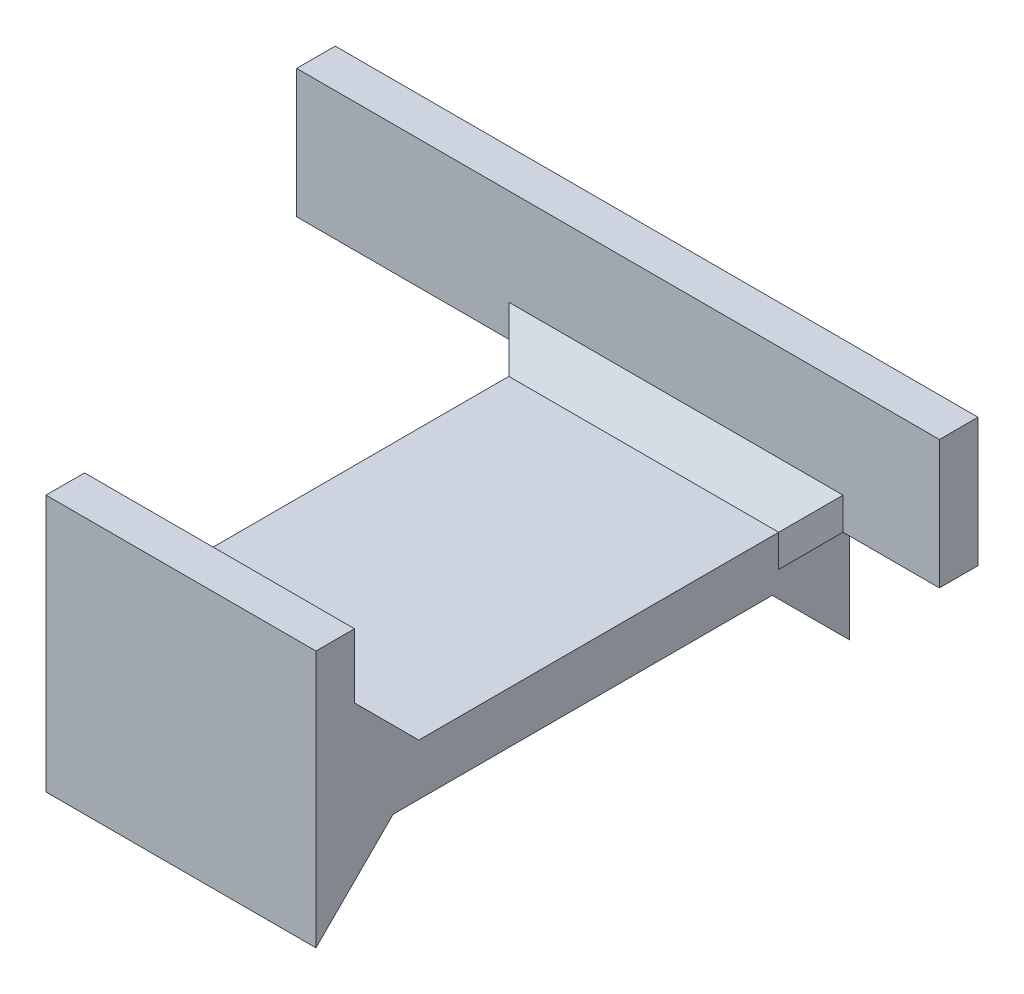
ISO-10303-21;
HEADER;
FILE_DESCRIPTION(('STEP AP214'),'2;1');
FILE_NAME('part.step','',(''),(''),'','','');
FILE_SCHEMA(('AUTOMOTIVE_DESIGN { 1 0 10303 214 1 1 1 1 }'));
ENDSEC;
DATA;
#1=APPLICATION_CONTEXT('core data for automotive mechanical design processes');
#2=APPLICATION_PROTOCOL_DEFINITION('international standard','automotive_design',2000,#1);
#3=PRODUCT_CONTEXT('',#1,'mechanical');
#4=PRODUCT('Part','Part','',(#3));
#5=PRODUCT_RELATED_PRODUCT_CATEGORY('part','',(#4));
#6=PRODUCT_DEFINITION_FORMATION('','',#4);
#7=PRODUCT_DEFINITION_CONTEXT('part definition',#1,'design');
#8=PRODUCT_DEFINITION('design','',#6,#7);
#9=PRODUCT_DEFINITION_SHAPE('','',#8);
#10=(LENGTH_UNIT() NAMED_UNIT(*) SI_UNIT(.MILLI.,.METRE.));
#11=(NAMED_UNIT(*) PLANE_ANGLE_UNIT() SI_UNIT($,.RADIAN.));
#12=(NAMED_UNIT(*) SI_UNIT($,.STERADIAN.) SOLID_ANGLE_UNIT());
#13=UNCERTAINTY_MEASURE_WITH_UNIT(LENGTH_MEASURE(1.E-05),#10,'distance_accuracy_value','');
#14=(GEOMETRIC_REPRESENTATION_CONTEXT(3) GLOBAL_UNCERTAINTY_ASSIGNED_CONTEXT((#13)) GLOBAL_UNIT_ASSIGNED_CONTEXT((#10,
#11,#12)) REPRESENTATION_CONTEXT('',''));
#15=CARTESIAN_POINT('',(0.,0.,0.));
#16=DIRECTION('',(0.,0.,1.));
#17=DIRECTION('',(1.,0.,0.));
#18=AXIS2_PLACEMENT_3D('',#15,#16,#17);
#19=CARTESIAN_POINT('',(-10.5,2.,41.5));
#20=DIRECTION('',(0.,-1.,0.));
#21=DIRECTION('',(0.,0.,-1.));
#22=AXIS2_PLACEMENT_3D('',#19,#20,#21);
#23=PLANE('',#22);
#24=DIRECTION('',(0.,0.,-1.));
#25=VECTOR('',#24,1.);
#26=CARTESIAN_POINT('',(10.5,2.,41.5));
#27=LINE('',#26,#25);
#28=CARTESIAN_POINT('',(10.5,2.,33.5));
#29=VERTEX_POINT('',#28);
#30=CARTESIAN_POINT('',(10.5,2.,5.49999999999998));
#31=VERTEX_POINT('',#30);
#32=EDGE_CURVE('E259',#29,#31,#27,.T.);
#33=ORIENTED_EDGE('',*,*,#32,.T.);
#34=DIRECTION('',(-1.,0.,0.));
#35=VECTOR('',#34,1.);
#36=CARTESIAN_POINT('',(-10.5,2.,5.49999999999998));
#37=LINE('',#36,#35);
#38=CARTESIAN_POINT('',(-10.5,2.,5.49999999999998));
#39=VERTEX_POINT('',#38);
#40=EDGE_CURVE('E272',#31,#39,#37,.T.);
#41=ORIENTED_EDGE('',*,*,#40,.T.);
#42=DIRECTION('',(0.,0.,-1.));
#43=VECTOR('',#42,1.);
#44=CARTESIAN_POINT('',(-10.5,2.,41.5));
#45=LINE('',#44,#43);
#46=CARTESIAN_POINT('',(-10.5,2.,33.5));
#47=VERTEX_POINT('',#46);
#48=EDGE_CURVE('E256',#47,#39,#45,.T.);
#49=ORIENTED_EDGE('',*,*,#48,.F.);
#50=DIRECTION('',(1.,0.,0.));
#51=VECTOR('',#50,1.);
#52=CARTESIAN_POINT('',(10.5,2.,33.5));
#53=LINE('',#52,#51);
#54=EDGE_CURVE('E265',#47,#29,#53,.T.);
#55=ORIENTED_EDGE('',*,*,#54,.T.);
#56=EDGE_LOOP('',(#33,#41,#49,#55));
#57=FACE_BOUND('',#56,.T.);
#58=ADVANCED_FACE('F47',(#57),#23,.F.);
#59=CARTESIAN_POINT('',(-10.5,-2.,41.5));
#60=DIRECTION('',(0.,1.,0.));
#61=DIRECTION('',(0.,0.,1.));
#62=AXIS2_PLACEMENT_3D('',#59,#60,#61);
#63=PLANE('',#62);
#64=DIRECTION('',(0.,0.,-1.));
#65=VECTOR('',#64,1.);
#66=CARTESIAN_POINT('',(-10.5,-2.,41.5));
#67=LINE('',#66,#65);
#68=CARTESIAN_POINT('',(-10.5,-2.,35.5));
#69=VERTEX_POINT('',#68);
#70=CARTESIAN_POINT('',(-10.5,-2.,6.));
#71=VERTEX_POINT('',#70);
#72=EDGE_CURVE('E254',#69,#71,#67,.T.);
#73=ORIENTED_EDGE('',*,*,#72,.T.);
#74=DIRECTION('',(1.,0.,0.));
#75=VECTOR('',#74,1.);
#76=CARTESIAN_POINT('',(-10.5,-2.,6.));
#77=LINE('',#76,#75);
#78=CARTESIAN_POINT('',(10.5,-2.,6.));
#79=VERTEX_POINT('',#78);
#80=EDGE_CURVE('E202',#71,#79,#77,.T.);
#81=ORIENTED_EDGE('',*,*,#80,.T.);
#82=DIRECTION('',(0.,0.,-1.));
#83=VECTOR('',#82,1.);
#84=CARTESIAN_POINT('',(10.5,-2.,41.5));
#85=LINE('',#84,#83);
#86=CARTESIAN_POINT('',(10.5,-2.,35.5));
#87=VERTEX_POINT('',#86);
#88=EDGE_CURVE('E249',#87,#79,#85,.T.);
#89=ORIENTED_EDGE('',*,*,#88,.F.);
#90=DIRECTION('',(1.,0.,0.));
#91=VECTOR('',#90,1.);
#92=CARTESIAN_POINT('',(-10.5,-2.,35.5));
#93=LINE('',#92,#91);
#94=EDGE_CURVE('E222',#69,#87,#93,.T.);
#95=ORIENTED_EDGE('',*,*,#94,.F.);
#96=EDGE_LOOP('',(#73,#81,#89,#95));
#97=FACE_BOUND('',#96,.T.);
#98=ADVANCED_FACE('F373',(#97),#63,.F.);
#99=CARTESIAN_POINT('',(10.5,-2.,41.5));
#100=DIRECTION('',(-1.,0.,0.));
#101=DIRECTION('',(0.,0.,1.));
#102=AXIS2_PLACEMENT_3D('',#99,#100,#101);
#103=PLANE('',#102);
#104=DIRECTION('',(0.,1.,0.));
#105=VECTOR('',#104,1.);
#106=CARTESIAN_POINT('',(10.5,-2.,0.));
#107=LINE('',#106,#105);
#108=CARTESIAN_POINT('',(10.5,-8.,0.));
#109=VERTEX_POINT('',#108);
#110=CARTESIAN_POINT('',(10.5,-0.500000000000018,0.));
#111=VERTEX_POINT('',#110);
#112=EDGE_CURVE('E243',#109,#111,#107,.T.);
#113=ORIENTED_EDGE('',*,*,#112,.T.);
#114=DIRECTION('',(0.,0.,1.));
#115=VECTOR('',#114,1.);
#116=CARTESIAN_POINT('',(10.5,-0.500000000000018,3.));
#117=LINE('',#116,#115);
#118=CARTESIAN_POINT('',(10.5,-0.500000000000018,5.50000000000002));
#119=VERTEX_POINT('',#118);
#120=EDGE_CURVE('E71',#111,#119,#117,.T.);
#121=ORIENTED_EDGE('',*,*,#120,.T.);
#122=DIRECTION('',(0.,1.,0.));
#123=VECTOR('',#122,1.);
#124=CARTESIAN_POINT('',(10.5,4.50000000000001,5.50000000000002));
#125=LINE('',#124,#123);
#126=EDGE_CURVE('E293',#119,#31,#125,.T.);
#127=ORIENTED_EDGE('',*,*,#126,.T.);
#128=ORIENTED_EDGE('',*,*,#32,.F.);
#129=DIRECTION('',(0.,-0.707106781186551,-0.707106781186544));
#130=VECTOR('',#129,1.);
#131=CARTESIAN_POINT('',(10.5,3.99999999999997,35.5));
#132=LINE('',#131,#130);
#133=CARTESIAN_POINT('',(10.5,7.00000000000003,38.5));
#134=VERTEX_POINT('',#133);
#135=EDGE_CURVE('E269',#29,#134,#132,.F.);
#136=ORIENTED_EDGE('',*,*,#135,.T.);
#137=DIRECTION('',(0.,-1.,0.));
#138=VECTOR('',#137,1.);
#139=CARTESIAN_POINT('',(10.5,12.,38.5));
#140=LINE('',#139,#138);
#141=CARTESIAN_POINT('',(10.5,12.,38.5));
#142=VERTEX_POINT('',#141);
#143=EDGE_CURVE('E240',#142,#134,#140,.T.);
#144=ORIENTED_EDGE('',*,*,#143,.F.);
#145=DIRECTION('',(0.,0.,-1.));
#146=VECTOR('',#145,1.);
#147=CARTESIAN_POINT('',(10.5,12.,41.5));
#148=LINE('',#147,#146);
#149=CARTESIAN_POINT('',(10.5,12.,41.5));
#150=VERTEX_POINT('',#149);
#151=EDGE_CURVE('E233',#150,#142,#148,.T.);
#152=ORIENTED_EDGE('',*,*,#151,.F.);
#153=DIRECTION('',(0.,1.,0.));
#154=VECTOR('',#153,1.);
#155=CARTESIAN_POINT('',(10.5,-2.,41.5));
#156=LINE('',#155,#154);
#157=CARTESIAN_POINT('',(10.5,-8.,41.5));
#158=VERTEX_POINT('',#157);
#159=EDGE_CURVE('E244',#158,#150,#156,.T.);
#160=ORIENTED_EDGE('',*,*,#159,.F.);
#161=DIRECTION('',(0.,0.707106781186548,-0.707106781186548));
#162=VECTOR('',#161,1.);
#163=CARTESIAN_POINT('',(10.5,-2.,35.5));
#164=LINE('',#163,#162);
#165=EDGE_CURVE('E213',#158,#87,#164,.T.);
#166=ORIENTED_EDGE('',*,*,#165,.T.);
#167=ORIENTED_EDGE('',*,*,#88,.T.);
#168=DIRECTION('',(0.,-0.707106781186547,-0.707106781186548));
#169=VECTOR('',#168,1.);
#170=CARTESIAN_POINT('',(10.5,-8.,0.));
#171=LINE('',#170,#169);
#172=EDGE_CURVE('E210',#79,#109,#171,.T.);
#173=ORIENTED_EDGE('',*,*,#172,.T.);
#174=EDGE_LOOP('',(#113,#121,#127,#128,#136,#144,#152,#160,#166,#167,#173));
#175=FACE_BOUND('',#174,.T.);
#176=ADVANCED_FACE('F306',(#175),#103,.F.);
#177=CARTESIAN_POINT('',(-10.5,-2.,41.5));
#178=DIRECTION('',(1.,0.,0.));
#179=DIRECTION('',(0.,0.,-1.));
#180=AXIS2_PLACEMENT_3D('',#177,#178,#179);
#181=PLANE('',#180);
#182=DIRECTION('',(0.,-1.,0.));
#183=VECTOR('',#182,1.);
#184=CARTESIAN_POINT('',(-10.5,2.,5.50000000000002));
#185=LINE('',#184,#183);
#186=CARTESIAN_POINT('',(-10.5,-0.500000000000018,5.50000000000002));
#187=VERTEX_POINT('',#186);
#188=EDGE_CURVE('E278',#39,#187,#185,.T.);
#189=ORIENTED_EDGE('',*,*,#188,.T.);
#190=DIRECTION('',(0.,0.,-1.));
#191=VECTOR('',#190,1.);
#192=CARTESIAN_POINT('',(-10.5,-0.500000000000018,0.));
#193=LINE('',#192,#191);
#194=CARTESIAN_POINT('',(-10.5,-0.500000000000018,0.));
#195=VERTEX_POINT('',#194);
#196=EDGE_CURVE('E280',#187,#195,#193,.T.);
#197=ORIENTED_EDGE('',*,*,#196,.T.);
#198=DIRECTION('',(0.,-1.,0.));
#199=VECTOR('',#198,1.);
#200=CARTESIAN_POINT('',(-10.5,-2.,0.));
#201=LINE('',#200,#199);
#202=CARTESIAN_POINT('',(-10.5,-8.,0.));
#203=VERTEX_POINT('',#202);
#204=EDGE_CURVE('E247',#195,#203,#201,.T.);
#205=ORIENTED_EDGE('',*,*,#204,.T.);
#206=DIRECTION('',(0.,-0.707106781186547,-0.707106781186548));
#207=VECTOR('',#206,1.);
#208=CARTESIAN_POINT('',(-10.5,-8.,0.));
#209=LINE('',#208,#207);
#210=EDGE_CURVE('E208',#71,#203,#209,.T.);
#211=ORIENTED_EDGE('',*,*,#210,.F.);
#212=ORIENTED_EDGE('',*,*,#72,.F.);
#213=DIRECTION('',(0.,0.707106781186548,-0.707106781186548));
#214=VECTOR('',#213,1.);
#215=CARTESIAN_POINT('',(-10.5,-2.,35.5));
#216=LINE('',#215,#214);
#217=CARTESIAN_POINT('',(-10.5,-8.,41.5));
#218=VERTEX_POINT('',#217);
#219=EDGE_CURVE('E216',#218,#69,#216,.T.);
#220=ORIENTED_EDGE('',*,*,#219,.F.);
#221=DIRECTION('',(0.,-1.,0.));
#222=VECTOR('',#221,1.);
#223=CARTESIAN_POINT('',(-10.5,-2.,41.5));
#224=LINE('',#223,#222);
#225=CARTESIAN_POINT('',(-10.5,12.,41.5));
#226=VERTEX_POINT('',#225);
#227=EDGE_CURVE('E246',#226,#218,#224,.T.);
#228=ORIENTED_EDGE('',*,*,#227,.F.);
#229=DIRECTION('',(0.,0.,1.));
#230=VECTOR('',#229,1.);
#231=CARTESIAN_POINT('',(-10.5,12.,38.5));
#232=LINE('',#231,#230);
#233=CARTESIAN_POINT('',(-10.5,12.,38.5));
#234=VERTEX_POINT('',#233);
#235=EDGE_CURVE('E225',#234,#226,#232,.T.);
#236=ORIENTED_EDGE('',*,*,#235,.F.);
#237=DIRECTION('',(0.,-1.,0.));
#238=VECTOR('',#237,1.);
#239=CARTESIAN_POINT('',(-10.5,12.,38.5));
#240=LINE('',#239,#238);
#241=CARTESIAN_POINT('',(-10.5,7.00000000000003,38.5));
#242=VERTEX_POINT('',#241);
#243=EDGE_CURVE('E237',#234,#242,#240,.T.);
#244=ORIENTED_EDGE('',*,*,#243,.T.);
#245=DIRECTION('',(0.,0.707106781186551,0.707106781186544));
#246=VECTOR('',#245,1.);
#247=CARTESIAN_POINT('',(-10.5,3.99999999999997,35.5));
#248=LINE('',#247,#246);
#249=EDGE_CURVE('E267',#242,#47,#248,.F.);
#250=ORIENTED_EDGE('',*,*,#249,.T.);
#251=ORIENTED_EDGE('',*,*,#48,.T.);
#252=EDGE_LOOP('',(#189,#197,#205,#211,#212,#220,#228,#236,#244,#250,#251));
#253=FACE_BOUND('',#252,.T.);
#254=ADVANCED_FACE('F330',(#253),#181,.F.);
#255=CARTESIAN_POINT('',(0.,0.,41.5));
#256=DIRECTION('',(0.,0.,-1.));
#257=DIRECTION('',(-1.,0.,0.));
#258=AXIS2_PLACEMENT_3D('',#255,#256,#257);
#259=PLANE('',#258);
#260=ORIENTED_EDGE('',*,*,#159,.T.);
#261=DIRECTION('',(1.,0.,0.));
#262=VECTOR('',#261,1.);
#263=CARTESIAN_POINT('',(-10.5,12.,41.5));
#264=LINE('',#263,#262);
#265=EDGE_CURVE('E230',#226,#150,#264,.T.);
#266=ORIENTED_EDGE('',*,*,#265,.F.);
#267=ORIENTED_EDGE('',*,*,#227,.T.);
#268=DIRECTION('',(1.,0.,0.));
#269=VECTOR('',#268,1.);
#270=CARTESIAN_POINT('',(-10.5,-8.,41.5));
#271=LINE('',#270,#269);
#272=EDGE_CURVE('E219',#218,#158,#271,.T.);
#273=ORIENTED_EDGE('',*,*,#272,.T.);
#274=EDGE_LOOP('',(#260,#266,#267,#273));
#275=FACE_BOUND('',#274,.T.);
#276=ADVANCED_FACE('F455',(#275),#259,.F.);
#277=CARTESIAN_POINT('',(0.,0.,0.));
#278=DIRECTION('',(0.,0.,-1.));
#279=DIRECTION('',(-1.,0.,0.));
#280=AXIS2_PLACEMENT_3D('',#277,#278,#279);
#281=PLANE('',#280);
#282=ORIENTED_EDGE('',*,*,#112,.F.);
#283=DIRECTION('',(1.,0.,0.));
#284=VECTOR('',#283,1.);
#285=CARTESIAN_POINT('',(-10.5,-8.,0.));
#286=LINE('',#285,#284);
#287=EDGE_CURVE('E199',#203,#109,#286,.T.);
#288=ORIENTED_EDGE('',*,*,#287,.F.);
#289=ORIENTED_EDGE('',*,*,#204,.F.);
#290=DIRECTION('',(0.707106781186551,-0.707106781186544,0.));
#291=VECTOR('',#290,1.);
#292=CARTESIAN_POINT('',(-13.,2.,0.));
#293=LINE('',#292,#291);
#294=CARTESIAN_POINT('',(-13.,2.,0.));
#295=VERTEX_POINT('',#294);
#296=EDGE_CURVE('E284',#195,#295,#293,.F.);
#297=ORIENTED_EDGE('',*,*,#296,.T.);
#298=DIRECTION('',(1.,0.,0.));
#299=VECTOR('',#298,1.);
#300=CARTESIAN_POINT('',(-29.5,2.,0.));
#301=LINE('',#300,#299);
#302=CARTESIAN_POINT('',(-29.5,2.,0.));
#303=VERTEX_POINT('',#302);
#304=EDGE_CURVE('E194',#303,#295,#301,.T.);
#305=ORIENTED_EDGE('',*,*,#304,.F.);
#306=DIRECTION('',(0.,-1.,0.));
#307=VECTOR('',#306,1.);
#308=CARTESIAN_POINT('',(-29.5,12.,0.));
#309=LINE('',#308,#307);
#310=CARTESIAN_POINT('',(-29.5,12.,0.));
#311=VERTEX_POINT('',#310);
#312=EDGE_CURVE('E345',#311,#303,#309,.T.);
#313=ORIENTED_EDGE('',*,*,#312,.F.);
#314=DIRECTION('',(1.,0.,0.));
#315=VECTOR('',#314,1.);
#316=CARTESIAN_POINT('',(-29.5,12.,0.));
#317=LINE('',#316,#315);
#318=CARTESIAN_POINT('',(20.5,12.,0.));
#319=VERTEX_POINT('',#318);
#320=EDGE_CURVE('E192',#311,#319,#317,.T.);
#321=ORIENTED_EDGE('',*,*,#320,.T.);
#322=DIRECTION('',(0.,-1.,0.));
#323=VECTOR('',#322,1.);
#324=CARTESIAN_POINT('',(20.5,12.,0.));
#325=LINE('',#324,#323);
#326=CARTESIAN_POINT('',(20.5,2.,0.));
#327=VERTEX_POINT('',#326);
#328=EDGE_CURVE('E204',#319,#327,#325,.T.);
#329=ORIENTED_EDGE('',*,*,#328,.T.);
#330=CARTESIAN_POINT('',(13.,2.,0.));
#331=VERTEX_POINT('',#330);
#332=EDGE_CURVE('E303',#331,#327,#301,.T.);
#333=ORIENTED_EDGE('',*,*,#332,.F.);
#334=DIRECTION('',(0.707106781186551,0.707106781186544,0.));
#335=VECTOR('',#334,1.);
#336=CARTESIAN_POINT('',(13.,2.,0.));
#337=LINE('',#336,#335);
#338=EDGE_CURVE('E57',#331,#111,#337,.F.);
#339=ORIENTED_EDGE('',*,*,#338,.T.);
#340=EDGE_LOOP('',(#282,#288,#289,#297,#305,#313,#321,#329,#333,#339));
#341=FACE_BOUND('',#340,.T.);
#342=ADVANCED_FACE('F300',(#341),#281,.T.);
#343=CARTESIAN_POINT('',(10.5,12.,38.5));
#344=DIRECTION('',(0.,0.,1.));
#345=DIRECTION('',(1.,0.,0.));
#346=AXIS2_PLACEMENT_3D('',#343,#344,#345);
#347=PLANE('',#346);
#348=ORIENTED_EDGE('',*,*,#143,.T.);
#349=DIRECTION('',(-1.,0.,0.));
#350=VECTOR('',#349,1.);
#351=CARTESIAN_POINT('',(-10.5,7.00000000000003,38.5));
#352=LINE('',#351,#350);
#353=EDGE_CURVE('E262',#134,#242,#352,.T.);
#354=ORIENTED_EDGE('',*,*,#353,.T.);
#355=ORIENTED_EDGE('',*,*,#243,.F.);
#356=DIRECTION('',(-1.,0.,0.));
#357=VECTOR('',#356,1.);
#358=CARTESIAN_POINT('',(10.5,12.,38.5));
#359=LINE('',#358,#357);
#360=EDGE_CURVE('E235',#142,#234,#359,.T.);
#361=ORIENTED_EDGE('',*,*,#360,.F.);
#362=EDGE_LOOP('',(#348,#354,#355,#361));
#363=FACE_BOUND('',#362,.T.);
#364=ADVANCED_FACE('F490',(#363),#347,.F.);
#365=CARTESIAN_POINT('',(0.,12.,0.));
#366=DIRECTION('',(0.,1.,0.));
#367=DIRECTION('',(0.,0.,1.));
#368=AXIS2_PLACEMENT_3D('',#365,#366,#367);
#369=PLANE('',#368);
#370=ORIENTED_EDGE('',*,*,#235,.T.);
#371=ORIENTED_EDGE('',*,*,#265,.T.);
#372=ORIENTED_EDGE('',*,*,#151,.T.);
#373=ORIENTED_EDGE('',*,*,#360,.T.);
#374=EDGE_LOOP('',(#370,#371,#372,#373));
#375=FACE_BOUND('',#374,.T.);
#376=ADVANCED_FACE('F392',(#375),#369,.T.);
#377=CARTESIAN_POINT('',(10.5,7.00000000000003,38.5));
#378=DIRECTION('',(0.,0.707106781186544,-0.707106781186551));
#379=DIRECTION('',(1.,0.,0.));
#380=AXIS2_PLACEMENT_3D('',#377,#378,#379);
#381=PLANE('',#380);
#382=ORIENTED_EDGE('',*,*,#135,.F.);
#383=ORIENTED_EDGE('',*,*,#54,.F.);
#384=ORIENTED_EDGE('',*,*,#249,.F.);
#385=ORIENTED_EDGE('',*,*,#353,.F.);
#386=EDGE_LOOP('',(#382,#383,#384,#385));
#387=FACE_BOUND('',#386,.T.);
#388=ADVANCED_FACE('F386',(#387),#381,.T.);
#389=CARTESIAN_POINT('',(-10.5,-2.,35.5));
#390=DIRECTION('',(0.,-0.707106781186547,-0.707106781186547));
#391=DIRECTION('',(0.,0.707106781186548,-0.707106781186548));
#392=AXIS2_PLACEMENT_3D('',#389,#390,#391);
#393=PLANE('',#392);
#394=ORIENTED_EDGE('',*,*,#165,.F.);
#395=ORIENTED_EDGE('',*,*,#272,.F.);
#396=ORIENTED_EDGE('',*,*,#219,.T.);
#397=ORIENTED_EDGE('',*,*,#94,.T.);
#398=EDGE_LOOP('',(#394,#395,#396,#397));
#399=FACE_BOUND('',#398,.T.);
#400=ADVANCED_FACE('F367',(#399),#393,.T.);
#401=CARTESIAN_POINT('',(-10.5,-8.,0.));
#402=DIRECTION('',(0.,-0.707106781186547,0.707106781186547));
#403=DIRECTION('',(0.,-0.707106781186548,-0.707106781186548));
#404=AXIS2_PLACEMENT_3D('',#401,#402,#403);
#405=PLANE('',#404);
#406=ORIENTED_EDGE('',*,*,#172,.F.);
#407=ORIENTED_EDGE('',*,*,#80,.F.);
#408=ORIENTED_EDGE('',*,*,#210,.T.);
#409=ORIENTED_EDGE('',*,*,#287,.T.);
#410=EDGE_LOOP('',(#406,#407,#408,#409));
#411=FACE_BOUND('',#410,.T.);
#412=ADVANCED_FACE('F359',(#411),#405,.T.);
#413=CARTESIAN_POINT('',(0.,2.,0.));
#414=DIRECTION('',(0.,1.,0.));
#415=DIRECTION('',(0.,0.,1.));
#416=AXIS2_PLACEMENT_3D('',#413,#414,#415);
#417=PLANE('',#416);
#418=DIRECTION('',(1.,0.,0.));
#419=VECTOR('',#418,1.);
#420=CARTESIAN_POINT('',(-29.5,2.,3.));
#421=LINE('',#420,#419);
#422=CARTESIAN_POINT('',(13.,2.,3.));
#423=VERTEX_POINT('',#422);
#424=CARTESIAN_POINT('',(20.5,2.,3.));
#425=VERTEX_POINT('',#424);
#426=EDGE_CURVE('E353',#423,#425,#421,.T.);
#427=ORIENTED_EDGE('',*,*,#426,.F.);
#428=DIRECTION('',(0.,0.,-1.));
#429=VECTOR('',#428,1.);
#430=CARTESIAN_POINT('',(13.,2.,0.));
#431=LINE('',#430,#429);
#432=EDGE_CURVE('E288',#423,#331,#431,.T.);
#433=ORIENTED_EDGE('',*,*,#432,.T.);
#434=ORIENTED_EDGE('',*,*,#332,.T.);
#435=DIRECTION('',(0.,0.,1.));
#436=VECTOR('',#435,1.);
#437=CARTESIAN_POINT('',(20.5,2.,0.));
#438=LINE('',#437,#436);
#439=EDGE_CURVE('E341',#327,#425,#438,.T.);
#440=ORIENTED_EDGE('',*,*,#439,.T.);
#441=EDGE_LOOP('',(#427,#433,#434,#440));
#442=FACE_BOUND('',#441,.T.);
#443=ADVANCED_FACE('F357',(#442),#417,.F.);
#444=ORIENTED_EDGE('',*,*,#304,.T.);
#445=DIRECTION('',(0.,0.,1.));
#446=VECTOR('',#445,1.);
#447=CARTESIAN_POINT('',(-13.,2.,3.));
#448=LINE('',#447,#446);
#449=CARTESIAN_POINT('',(-13.0000000000001,2.,3.));
#450=VERTEX_POINT('',#449);
#451=EDGE_CURVE('E275',#295,#450,#448,.T.);
#452=ORIENTED_EDGE('',*,*,#451,.T.);
#453=CARTESIAN_POINT('',(-29.5,2.,3.));
#454=VERTEX_POINT('',#453);
#455=EDGE_CURVE('E352',#454,#450,#421,.T.);
#456=ORIENTED_EDGE('',*,*,#455,.F.);
#457=DIRECTION('',(0.,0.,1.));
#458=VECTOR('',#457,1.);
#459=CARTESIAN_POINT('',(-29.5,2.,0.));
#460=LINE('',#459,#458);
#461=EDGE_CURVE('E198',#303,#454,#460,.T.);
#462=ORIENTED_EDGE('',*,*,#461,.F.);
#463=EDGE_LOOP('',(#444,#452,#456,#462));
#464=FACE_BOUND('',#463,.T.);
#465=ADVANCED_FACE('F339',(#464),#417,.F.);
#466=CARTESIAN_POINT('',(-29.5,12.,0.));
#467=DIRECTION('',(1.,0.,0.));
#468=DIRECTION('',(0.,0.,-1.));
#469=AXIS2_PLACEMENT_3D('',#466,#467,#468);
#470=PLANE('',#469);
#471=ORIENTED_EDGE('',*,*,#461,.T.);
#472=DIRECTION('',(0.,-1.,0.));
#473=VECTOR('',#472,1.);
#474=CARTESIAN_POINT('',(-29.5,12.,3.));
#475=LINE('',#474,#473);
#476=CARTESIAN_POINT('',(-29.5,12.,3.));
#477=VERTEX_POINT('',#476);
#478=EDGE_CURVE('E178',#477,#454,#475,.T.);
#479=ORIENTED_EDGE('',*,*,#478,.F.);
#480=DIRECTION('',(0.,0.,1.));
#481=VECTOR('',#480,1.);
#482=CARTESIAN_POINT('',(-29.5,12.,0.));
#483=LINE('',#482,#481);
#484=EDGE_CURVE('E186',#311,#477,#483,.T.);
#485=ORIENTED_EDGE('',*,*,#484,.F.);
#486=ORIENTED_EDGE('',*,*,#312,.T.);
#487=EDGE_LOOP('',(#471,#479,#485,#486));
#488=FACE_BOUND('',#487,.T.);
#489=ADVANCED_FACE('F196',(#488),#470,.F.);
#490=CARTESIAN_POINT('',(-29.5,12.,3.));
#491=DIRECTION('',(0.,0.,-1.));
#492=DIRECTION('',(-1.,0.,0.));
#493=AXIS2_PLACEMENT_3D('',#490,#491,#492);
#494=PLANE('',#493);
#495=DIRECTION('',(1.,0.,0.));
#496=VECTOR('',#495,1.);
#497=CARTESIAN_POINT('',(10.5,4.50000000000001,3.));
#498=LINE('',#497,#496);
#499=CARTESIAN_POINT('',(-13.,4.50000000000001,3.));
#500=VERTEX_POINT('',#499);
#501=CARTESIAN_POINT('',(13.,4.50000000000001,3.));
#502=VERTEX_POINT('',#501);
#503=EDGE_CURVE('E64',#500,#502,#498,.T.);
#504=ORIENTED_EDGE('',*,*,#503,.T.);
#505=DIRECTION('',(0.,-1.,0.));
#506=VECTOR('',#505,1.);
#507=CARTESIAN_POINT('',(13.,2.,3.));
#508=LINE('',#507,#506);
#509=EDGE_CURVE('E296',#502,#423,#508,.T.);
#510=ORIENTED_EDGE('',*,*,#509,.T.);
#511=ORIENTED_EDGE('',*,*,#426,.T.);
#512=DIRECTION('',(0.,-1.,0.));
#513=VECTOR('',#512,1.);
#514=CARTESIAN_POINT('',(20.5,12.,3.));
#515=LINE('',#514,#513);
#516=CARTESIAN_POINT('',(20.5,12.,3.));
#517=VERTEX_POINT('',#516);
#518=EDGE_CURVE('E181',#517,#425,#515,.T.);
#519=ORIENTED_EDGE('',*,*,#518,.F.);
#520=DIRECTION('',(1.,0.,0.));
#521=VECTOR('',#520,1.);
#522=CARTESIAN_POINT('',(-29.5,12.,3.));
#523=LINE('',#522,#521);
#524=EDGE_CURVE('E173',#477,#517,#523,.T.);
#525=ORIENTED_EDGE('',*,*,#524,.F.);
#526=ORIENTED_EDGE('',*,*,#478,.T.);
#527=ORIENTED_EDGE('',*,*,#455,.T.);
#528=DIRECTION('',(0.,1.,0.));
#529=VECTOR('',#528,1.);
#530=CARTESIAN_POINT('',(-13.,4.50000000000001,3.));
#531=LINE('',#530,#529);
#532=EDGE_CURVE('E282',#450,#500,#531,.T.);
#533=ORIENTED_EDGE('',*,*,#532,.T.);
#534=EDGE_LOOP('',(#504,#510,#511,#519,#525,#526,#527,#533));
#535=FACE_BOUND('',#534,.T.);
#536=ADVANCED_FACE('F175',(#535),#494,.F.);
#537=CARTESIAN_POINT('',(20.5,12.,0.));
#538=DIRECTION('',(1.,0.,0.));
#539=DIRECTION('',(0.,0.,-1.));
#540=AXIS2_PLACEMENT_3D('',#537,#538,#539);
#541=PLANE('',#540);
#542=ORIENTED_EDGE('',*,*,#439,.F.);
#543=ORIENTED_EDGE('',*,*,#328,.F.);
#544=DIRECTION('',(0.,0.,1.));
#545=VECTOR('',#544,1.);
#546=CARTESIAN_POINT('',(20.5,12.,0.));
#547=LINE('',#546,#545);
#548=EDGE_CURVE('E185',#319,#517,#547,.T.);
#549=ORIENTED_EDGE('',*,*,#548,.T.);
#550=ORIENTED_EDGE('',*,*,#518,.T.);
#551=EDGE_LOOP('',(#542,#543,#549,#550));
#552=FACE_BOUND('',#551,.T.);
#553=ADVANCED_FACE('F349',(#552),#541,.T.);
#554=CARTESIAN_POINT('',(0.,12.,0.));
#555=DIRECTION('',(0.,1.,0.));
#556=DIRECTION('',(0.,0.,1.));
#557=AXIS2_PLACEMENT_3D('',#554,#555,#556);
#558=PLANE('',#557);
#559=ORIENTED_EDGE('',*,*,#484,.T.);
#560=ORIENTED_EDGE('',*,*,#524,.T.);
#561=ORIENTED_EDGE('',*,*,#548,.F.);
#562=ORIENTED_EDGE('',*,*,#320,.F.);
#563=EDGE_LOOP('',(#559,#560,#561,#562));
#564=FACE_BOUND('',#563,.T.);
#565=ADVANCED_FACE('F190',(#564),#558,.T.);
#566=CARTESIAN_POINT('',(-29.5,4.50000000000001,3.));
#567=DIRECTION('',(0.,0.707106781186543,0.707106781186552));
#568=DIRECTION('',(-1.,0.,0.));
#569=AXIS2_PLACEMENT_3D('',#566,#567,#568);
#570=PLANE('',#569);
#571=ORIENTED_EDGE('',*,*,#503,.F.);
#572=DIRECTION('',(0.577350269189627,-0.577350269189629,0.577350269189622));
#573=VECTOR('',#572,1.);
#574=CARTESIAN_POINT('',(-18.5000000000001,10.,-2.49999999999996));
#575=LINE('',#574,#573);
#576=EDGE_CURVE('E286',#500,#39,#575,.T.);
#577=ORIENTED_EDGE('',*,*,#576,.T.);
#578=ORIENTED_EDGE('',*,*,#40,.F.);
#579=DIRECTION('',(0.577350269189627,0.577350269189629,-0.577350269189622));
#580=VECTOR('',#579,1.);
#581=CARTESIAN_POINT('',(-1.16666666666668,-9.66666666666677,17.1666666666666));
#582=LINE('',#581,#580);
#583=EDGE_CURVE('E11',#31,#502,#582,.T.);
#584=ORIENTED_EDGE('',*,*,#583,.T.);
#585=EDGE_LOOP('',(#571,#577,#578,#584));
#586=FACE_BOUND('',#585,.T.);
#587=ADVANCED_FACE('F321',(#586),#570,.T.);
#588=CARTESIAN_POINT('',(-13.,12.,3.));
#589=DIRECTION('',(-0.707106781186544,0.,0.707106781186551));
#590=DIRECTION('',(0.,-1.,0.));
#591=AXIS2_PLACEMENT_3D('',#588,#589,#590);
#592=PLANE('',#591);
#593=ORIENTED_EDGE('',*,*,#576,.F.);
#594=ORIENTED_EDGE('',*,*,#532,.F.);
#595=DIRECTION('',(0.57735026918963,-0.577350269189624,0.577350269189624));
#596=VECTOR('',#595,1.);
#597=CARTESIAN_POINT('',(-16.3333333333334,5.33333333333331,-0.333333333333311));
#598=LINE('',#597,#596);
#599=EDGE_CURVE('E289',#187,#450,#598,.F.);
#600=ORIENTED_EDGE('',*,*,#599,.F.);
#601=ORIENTED_EDGE('',*,*,#188,.F.);
#602=EDGE_LOOP('',(#593,#594,#600,#601));
#603=FACE_BOUND('',#602,.T.);
#604=ADVANCED_FACE('F326',(#603),#592,.T.);
#605=CARTESIAN_POINT('',(-13.,2.,0.));
#606=DIRECTION('',(-0.707106781186544,-0.707106781186551,0.));
#607=DIRECTION('',(0.,0.,-1.));
#608=AXIS2_PLACEMENT_3D('',#605,#606,#607);
#609=PLANE('',#608);
#610=ORIENTED_EDGE('',*,*,#296,.F.);
#611=ORIENTED_EDGE('',*,*,#196,.F.);
#612=ORIENTED_EDGE('',*,*,#599,.T.);
#613=ORIENTED_EDGE('',*,*,#451,.F.);
#614=EDGE_LOOP('',(#610,#611,#612,#613));
#615=FACE_BOUND('',#614,.T.);
#616=ADVANCED_FACE('F334',(#615),#609,.T.);
#617=CARTESIAN_POINT('',(13.,12.,3.));
#618=DIRECTION('',(0.707106781186544,0.,0.707106781186551));
#619=DIRECTION('',(0.,1.,0.));
#620=AXIS2_PLACEMENT_3D('',#617,#618,#619);
#621=PLANE('',#620);
#622=ORIENTED_EDGE('',*,*,#583,.F.);
#623=ORIENTED_EDGE('',*,*,#126,.F.);
#624=DIRECTION('',(0.577350269189629,0.577350269189623,-0.577350269189624));
#625=VECTOR('',#624,1.);
#626=CARTESIAN_POINT('',(16.3333333333334,5.3333333333333,-0.333333333333314));
#627=LINE('',#626,#625);
#628=EDGE_CURVE('E52',#423,#119,#627,.F.);
#629=ORIENTED_EDGE('',*,*,#628,.F.);
#630=ORIENTED_EDGE('',*,*,#509,.F.);
#631=EDGE_LOOP('',(#622,#623,#629,#630));
#632=FACE_BOUND('',#631,.T.);
#633=ADVANCED_FACE('F50',(#632),#621,.T.);
#634=CARTESIAN_POINT('',(13.,2.,0.));
#635=DIRECTION('',(0.707106781186544,-0.707106781186551,0.));
#636=DIRECTION('',(0.,0.,1.));
#637=AXIS2_PLACEMENT_3D('',#634,#635,#636);
#638=PLANE('',#637);
#639=ORIENTED_EDGE('',*,*,#628,.T.);
#640=ORIENTED_EDGE('',*,*,#120,.F.);
#641=ORIENTED_EDGE('',*,*,#338,.F.);
#642=ORIENTED_EDGE('',*,*,#432,.F.);
#643=EDGE_LOOP('',(#639,#640,#641,#642));
#644=FACE_BOUND('',#643,.T.);
#645=ADVANCED_FACE('F309',(#644),#638,.T.);
#646=CLOSED_SHELL('',(#58,#98,#176,#254,#276,#342,#364,#376,#388,#400,#412,#443,#465,#489,#536,
#553,#565,#587,#604,#616,#633,#645));
#647=MANIFOLD_SOLID_BREP('B2',#646);
#648=ADVANCED_BREP_SHAPE_REPRESENTATION('',(#18,#647),#14);
#649=SHAPE_DEFINITION_REPRESENTATION(#9,#648);
ENDSEC;
END-ISO-10303-21;
